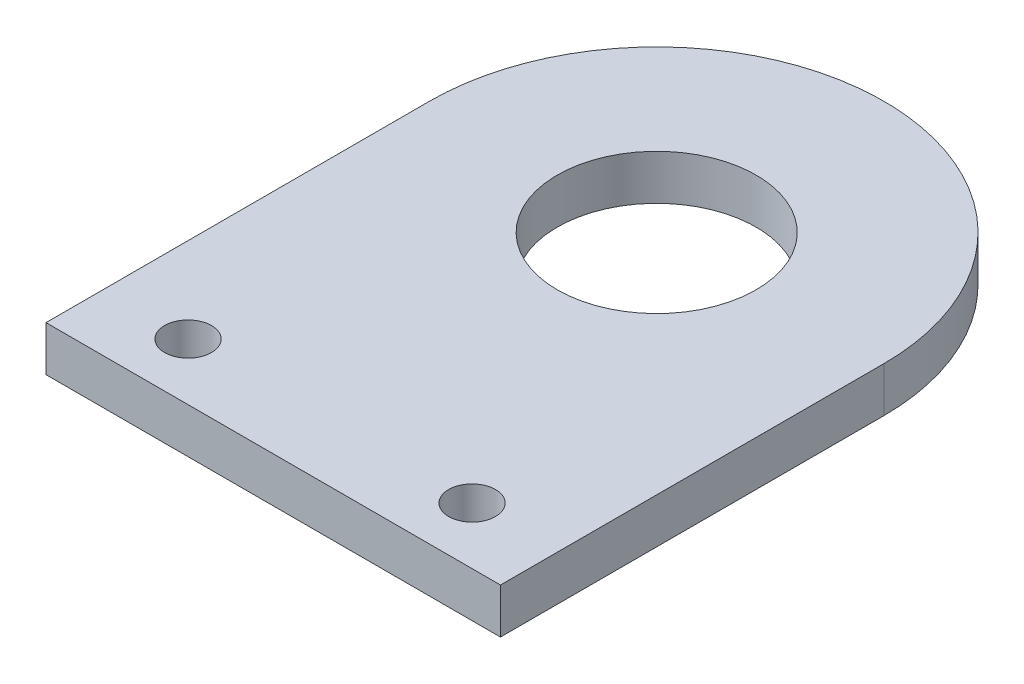
ISO-10303-21;
HEADER;
FILE_DESCRIPTION(('STEP AP214'),'2;1');
FILE_NAME('part.step','',(''),(''),'','','');
FILE_SCHEMA(('AUTOMOTIVE_DESIGN { 1 0 10303 214 1 1 1 1 }'));
ENDSEC;
DATA;
#1=APPLICATION_CONTEXT('core data for automotive mechanical design processes');
#2=APPLICATION_PROTOCOL_DEFINITION('international standard','automotive_design',2000,#1);
#3=PRODUCT_CONTEXT('',#1,'mechanical');
#4=PRODUCT('Part','Part','',(#3));
#5=PRODUCT_RELATED_PRODUCT_CATEGORY('part','',(#4));
#6=PRODUCT_DEFINITION_FORMATION('','',#4);
#7=PRODUCT_DEFINITION_CONTEXT('part definition',#1,'design');
#8=PRODUCT_DEFINITION('design','',#6,#7);
#9=PRODUCT_DEFINITION_SHAPE('','',#8);
#10=(LENGTH_UNIT() NAMED_UNIT(*) SI_UNIT(.MILLI.,.METRE.));
#11=(NAMED_UNIT(*) PLANE_ANGLE_UNIT() SI_UNIT($,.RADIAN.));
#12=(NAMED_UNIT(*) SI_UNIT($,.STERADIAN.) SOLID_ANGLE_UNIT());
#13=UNCERTAINTY_MEASURE_WITH_UNIT(LENGTH_MEASURE(1.E-05),#10,'distance_accuracy_value','');
#14=(GEOMETRIC_REPRESENTATION_CONTEXT(3) GLOBAL_UNCERTAINTY_ASSIGNED_CONTEXT((#13)) GLOBAL_UNIT_ASSIGNED_CONTEXT((#10,
#11,#12)) REPRESENTATION_CONTEXT('',''));
#15=CARTESIAN_POINT('',(0.,0.,0.));
#16=DIRECTION('',(0.,0.,1.));
#17=DIRECTION('',(1.,0.,0.));
#18=AXIS2_PLACEMENT_3D('',#15,#16,#17);
#19=CARTESIAN_POINT('',(0.,3.175,0.));
#20=DIRECTION('',(0.,0.,-1.));
#21=DIRECTION('',(-1.,0.,0.));
#22=AXIS2_PLACEMENT_3D('',#19,#20,#21);
#23=PLANE('',#22);
#24=DIRECTION('',(1.,0.,0.));
#25=VECTOR('',#24,1.);
#26=CARTESIAN_POINT('',(0.,0.,0.));
#27=LINE('',#26,#25);
#28=CARTESIAN_POINT('',(0.,0.,0.));
#29=VERTEX_POINT('',#28);
#30=CARTESIAN_POINT('',(32.,0.,0.));
#31=VERTEX_POINT('',#30);
#32=EDGE_CURVE('E108',#29,#31,#27,.T.);
#33=ORIENTED_EDGE('',*,*,#32,.T.);
#34=DIRECTION('',(0.,-1.,0.));
#35=VECTOR('',#34,1.);
#36=CARTESIAN_POINT('',(32.,3.175,0.));
#37=LINE('',#36,#35);
#38=CARTESIAN_POINT('',(32.,3.175,0.));
#39=VERTEX_POINT('',#38);
#40=EDGE_CURVE('E11',#39,#31,#37,.T.);
#41=ORIENTED_EDGE('',*,*,#40,.F.);
#42=DIRECTION('',(1.,0.,0.));
#43=VECTOR('',#42,1.);
#44=CARTESIAN_POINT('',(0.,3.175,0.));
#45=LINE('',#44,#43);
#46=CARTESIAN_POINT('',(0.,3.175,0.));
#47=VERTEX_POINT('',#46);
#48=EDGE_CURVE('E85',#47,#39,#45,.T.);
#49=ORIENTED_EDGE('',*,*,#48,.F.);
#50=DIRECTION('',(0.,-1.,0.));
#51=VECTOR('',#50,1.);
#52=CARTESIAN_POINT('',(0.,3.175,0.));
#53=LINE('',#52,#51);
#54=EDGE_CURVE('E51',#47,#29,#53,.T.);
#55=ORIENTED_EDGE('',*,*,#54,.T.);
#56=EDGE_LOOP('',(#33,#41,#49,#55));
#57=FACE_BOUND('',#56,.T.);
#58=ADVANCED_FACE('F34',(#57),#23,.F.);
#59=CARTESIAN_POINT('',(32.,3.175,0.));
#60=DIRECTION('',(-1.,0.,0.));
#61=DIRECTION('',(0.,0.,1.));
#62=AXIS2_PLACEMENT_3D('',#59,#60,#61);
#63=PLANE('',#62);
#64=DIRECTION('',(0.,0.,-1.));
#65=VECTOR('',#64,1.);
#66=CARTESIAN_POINT('',(32.,0.,0.));
#67=LINE('',#66,#65);
#68=CARTESIAN_POINT('',(32.,0.,-27.));
#69=VERTEX_POINT('',#68);
#70=EDGE_CURVE('E90',#31,#69,#67,.T.);
#71=ORIENTED_EDGE('',*,*,#70,.T.);
#72=DIRECTION('',(0.,-1.,0.));
#73=VECTOR('',#72,1.);
#74=CARTESIAN_POINT('',(32.,3.175,-27.));
#75=LINE('',#74,#73);
#76=CARTESIAN_POINT('',(32.,3.175,-27.));
#77=VERTEX_POINT('',#76);
#78=EDGE_CURVE('E43',#77,#69,#75,.T.);
#79=ORIENTED_EDGE('',*,*,#78,.F.);
#80=DIRECTION('',(0.,0.,-1.));
#81=VECTOR('',#80,1.);
#82=CARTESIAN_POINT('',(32.,3.175,0.));
#83=LINE('',#82,#81);
#84=EDGE_CURVE('E76',#39,#77,#83,.T.);
#85=ORIENTED_EDGE('',*,*,#84,.F.);
#86=ORIENTED_EDGE('',*,*,#40,.T.);
#87=EDGE_LOOP('',(#71,#79,#85,#86));
#88=FACE_BOUND('',#87,.T.);
#89=ADVANCED_FACE('F89',(#88),#63,.F.);
#90=CARTESIAN_POINT('',(16.,3.175,-27.));
#91=DIRECTION('',(0.,-1.,0.));
#92=DIRECTION('',(0.,0.,-1.));
#93=AXIS2_PLACEMENT_3D('',#90,#91,#92);
#94=CYLINDRICAL_SURFACE('',#93,16.);
#95=CARTESIAN_POINT('',(16.,0.,-27.));
#96=DIRECTION('',(0.,1.,0.));
#97=DIRECTION('',(0.,0.,1.));
#98=AXIS2_PLACEMENT_3D('',#95,#96,#97);
#99=CIRCLE('',#98,16.);
#100=CARTESIAN_POINT('',(0.,0.,-27.));
#101=VERTEX_POINT('',#100);
#102=EDGE_CURVE('E111',#101,#69,#99,.F.);
#103=ORIENTED_EDGE('',*,*,#102,.F.);
#104=DIRECTION('',(0.,-1.,0.));
#105=VECTOR('',#104,1.);
#106=CARTESIAN_POINT('',(0.,3.175,-27.));
#107=LINE('',#106,#105);
#108=CARTESIAN_POINT('',(0.,3.175,-27.));
#109=VERTEX_POINT('',#108);
#110=EDGE_CURVE('E65',#109,#101,#107,.T.);
#111=ORIENTED_EDGE('',*,*,#110,.F.);
#112=CARTESIAN_POINT('',(16.,3.175,-27.));
#113=DIRECTION('',(0.,1.,0.));
#114=DIRECTION('',(0.,0.,1.));
#115=AXIS2_PLACEMENT_3D('',#112,#113,#114);
#116=CIRCLE('',#115,16.);
#117=EDGE_CURVE('E84',#109,#77,#116,.F.);
#118=ORIENTED_EDGE('',*,*,#117,.T.);
#119=ORIENTED_EDGE('',*,*,#78,.T.);
#120=EDGE_LOOP('',(#103,#111,#118,#119));
#121=FACE_BOUND('',#120,.T.);
#122=ADVANCED_FACE('F93',(#121),#94,.T.);
#123=CARTESIAN_POINT('',(6.,3.175,-4.));
#124=DIRECTION('',(0.,-1.,0.));
#125=DIRECTION('',(0.,0.,-1.));
#126=AXIS2_PLACEMENT_3D('',#123,#124,#125);
#127=CYLINDRICAL_SURFACE('',#126,1.65);
#128=CARTESIAN_POINT('',(6.,3.175,-4.));
#129=DIRECTION('',(0.,1.,0.));
#130=DIRECTION('',(0.,0.,1.));
#131=AXIS2_PLACEMENT_3D('',#128,#129,#130);
#132=CIRCLE('',#131,1.65);
#133=CARTESIAN_POINT('',(6.,3.175,-2.35));
#134=VERTEX_POINT('',#133);
#135=EDGE_CURVE('E96',#134,#134,#132,.T.);
#136=ORIENTED_EDGE('',*,*,#135,.T.);
#137=EDGE_LOOP('',(#136));
#138=FACE_BOUND('',#137,.T.);
#139=CARTESIAN_POINT('',(6.,0.,-4.));
#140=DIRECTION('',(0.,1.,0.));
#141=DIRECTION('',(0.,0.,1.));
#142=AXIS2_PLACEMENT_3D('',#139,#140,#141);
#143=CIRCLE('',#142,1.65);
#144=CARTESIAN_POINT('',(6.,0.,-2.35));
#145=VERTEX_POINT('',#144);
#146=EDGE_CURVE('E116',#145,#145,#143,.T.);
#147=ORIENTED_EDGE('',*,*,#146,.F.);
#148=EDGE_LOOP('',(#147));
#149=FACE_BOUND('',#148,.T.);
#150=ADVANCED_FACE('F152',(#138,#149),#127,.F.);
#151=CARTESIAN_POINT('',(0.,3.175,0.));
#152=DIRECTION('',(-1.,0.,0.));
#153=DIRECTION('',(0.,0.,1.));
#154=AXIS2_PLACEMENT_3D('',#151,#152,#153);
#155=PLANE('',#154);
#156=DIRECTION('',(0.,0.,-1.));
#157=VECTOR('',#156,1.);
#158=CARTESIAN_POINT('',(0.,0.,0.));
#159=LINE('',#158,#157);
#160=EDGE_CURVE('E113',#29,#101,#159,.T.);
#161=ORIENTED_EDGE('',*,*,#160,.F.);
#162=ORIENTED_EDGE('',*,*,#54,.F.);
#163=DIRECTION('',(0.,0.,-1.));
#164=VECTOR('',#163,1.);
#165=CARTESIAN_POINT('',(0.,3.175,0.));
#166=LINE('',#165,#164);
#167=EDGE_CURVE('E94',#47,#109,#166,.T.);
#168=ORIENTED_EDGE('',*,*,#167,.T.);
#169=ORIENTED_EDGE('',*,*,#110,.T.);
#170=EDGE_LOOP('',(#161,#162,#168,#169));
#171=FACE_BOUND('',#170,.T.);
#172=ADVANCED_FACE('F153',(#171),#155,.T.);
#173=CARTESIAN_POINT('',(16.,3.175,-27.));
#174=DIRECTION('',(0.,-1.,0.));
#175=DIRECTION('',(0.,0.,-1.));
#176=AXIS2_PLACEMENT_3D('',#173,#174,#175);
#177=CYLINDRICAL_SURFACE('',#176,7.);
#178=CARTESIAN_POINT('',(16.,3.175,-27.));
#179=DIRECTION('',(0.,1.,0.));
#180=DIRECTION('',(0.,0.,1.));
#181=AXIS2_PLACEMENT_3D('',#178,#179,#180);
#182=CIRCLE('',#181,7.);
#183=CARTESIAN_POINT('',(16.,3.175,-20.));
#184=VERTEX_POINT('',#183);
#185=EDGE_CURVE('E122',#184,#184,#182,.T.);
#186=ORIENTED_EDGE('',*,*,#185,.T.);
#187=EDGE_LOOP('',(#186));
#188=FACE_BOUND('',#187,.T.);
#189=CARTESIAN_POINT('',(16.,0.,-27.));
#190=DIRECTION('',(0.,1.,0.));
#191=DIRECTION('',(0.,0.,1.));
#192=AXIS2_PLACEMENT_3D('',#189,#190,#191);
#193=CIRCLE('',#192,7.);
#194=CARTESIAN_POINT('',(16.,0.,-20.));
#195=VERTEX_POINT('',#194);
#196=EDGE_CURVE('E105',#195,#195,#193,.T.);
#197=ORIENTED_EDGE('',*,*,#196,.F.);
#198=EDGE_LOOP('',(#197));
#199=FACE_BOUND('',#198,.T.);
#200=ADVANCED_FACE('F36',(#188,#199),#177,.F.);
#201=CARTESIAN_POINT('',(26.,3.175,-4.));
#202=DIRECTION('',(0.,-1.,0.));
#203=DIRECTION('',(0.,0.,-1.));
#204=AXIS2_PLACEMENT_3D('',#201,#202,#203);
#205=CYLINDRICAL_SURFACE('',#204,1.65);
#206=CARTESIAN_POINT('',(26.,3.175,-4.));
#207=DIRECTION('',(0.,1.,0.));
#208=DIRECTION('',(0.,0.,1.));
#209=AXIS2_PLACEMENT_3D('',#206,#207,#208);
#210=CIRCLE('',#209,1.65);
#211=CARTESIAN_POINT('',(26.,3.175,-2.35));
#212=VERTEX_POINT('',#211);
#213=EDGE_CURVE('E102',#212,#212,#210,.T.);
#214=ORIENTED_EDGE('',*,*,#213,.T.);
#215=EDGE_LOOP('',(#214));
#216=FACE_BOUND('',#215,.T.);
#217=CARTESIAN_POINT('',(26.,0.,-4.));
#218=DIRECTION('',(0.,1.,0.));
#219=DIRECTION('',(0.,0.,1.));
#220=AXIS2_PLACEMENT_3D('',#217,#218,#219);
#221=CIRCLE('',#220,1.65);
#222=CARTESIAN_POINT('',(26.,0.,-2.35));
#223=VERTEX_POINT('',#222);
#224=EDGE_CURVE('E119',#223,#223,#221,.T.);
#225=ORIENTED_EDGE('',*,*,#224,.F.);
#226=EDGE_LOOP('',(#225));
#227=FACE_BOUND('',#226,.T.);
#228=ADVANCED_FACE('F134',(#216,#227),#205,.F.);
#229=CARTESIAN_POINT('',(0.,3.175,0.));
#230=DIRECTION('',(0.,1.,0.));
#231=DIRECTION('',(0.,0.,1.));
#232=AXIS2_PLACEMENT_3D('',#229,#230,#231);
#233=PLANE('',#232);
#234=ORIENTED_EDGE('',*,*,#185,.F.);
#235=EDGE_LOOP('',(#234));
#236=FACE_BOUND('',#235,.T.);
#237=ORIENTED_EDGE('',*,*,#48,.T.);
#238=ORIENTED_EDGE('',*,*,#84,.T.);
#239=ORIENTED_EDGE('',*,*,#117,.F.);
#240=ORIENTED_EDGE('',*,*,#167,.F.);
#241=EDGE_LOOP('',(#237,#238,#239,#240));
#242=FACE_BOUND('',#241,.T.);
#243=ORIENTED_EDGE('',*,*,#135,.F.);
#244=EDGE_LOOP('',(#243));
#245=FACE_BOUND('',#244,.T.);
#246=ORIENTED_EDGE('',*,*,#213,.F.);
#247=EDGE_LOOP('',(#246));
#248=FACE_BOUND('',#247,.T.);
#249=ADVANCED_FACE('F80',(#236,#242,#245,#248),#233,.T.);
#250=CARTESIAN_POINT('',(0.,0.,0.));
#251=DIRECTION('',(0.,1.,0.));
#252=DIRECTION('',(0.,0.,1.));
#253=AXIS2_PLACEMENT_3D('',#250,#251,#252);
#254=PLANE('',#253);
#255=ORIENTED_EDGE('',*,*,#196,.T.);
#256=EDGE_LOOP('',(#255));
#257=FACE_BOUND('',#256,.T.);
#258=ORIENTED_EDGE('',*,*,#32,.F.);
#259=ORIENTED_EDGE('',*,*,#160,.T.);
#260=ORIENTED_EDGE('',*,*,#102,.T.);
#261=ORIENTED_EDGE('',*,*,#70,.F.);
#262=EDGE_LOOP('',(#258,#259,#260,#261));
#263=FACE_BOUND('',#262,.T.);
#264=ORIENTED_EDGE('',*,*,#146,.T.);
#265=EDGE_LOOP('',(#264));
#266=FACE_BOUND('',#265,.T.);
#267=ORIENTED_EDGE('',*,*,#224,.T.);
#268=EDGE_LOOP('',(#267));
#269=FACE_BOUND('',#268,.T.);
#270=ADVANCED_FACE('F133',(#257,#263,#266,#269),#254,.F.);
#271=CLOSED_SHELL('',(#58,#89,#122,#150,#172,#200,#228,#249,#270));
#272=MANIFOLD_SOLID_BREP('B2',#271);
#273=ADVANCED_BREP_SHAPE_REPRESENTATION('',(#18,#272),#14);
#274=SHAPE_DEFINITION_REPRESENTATION(#9,#273);
ENDSEC;
END-ISO-10303-21;
